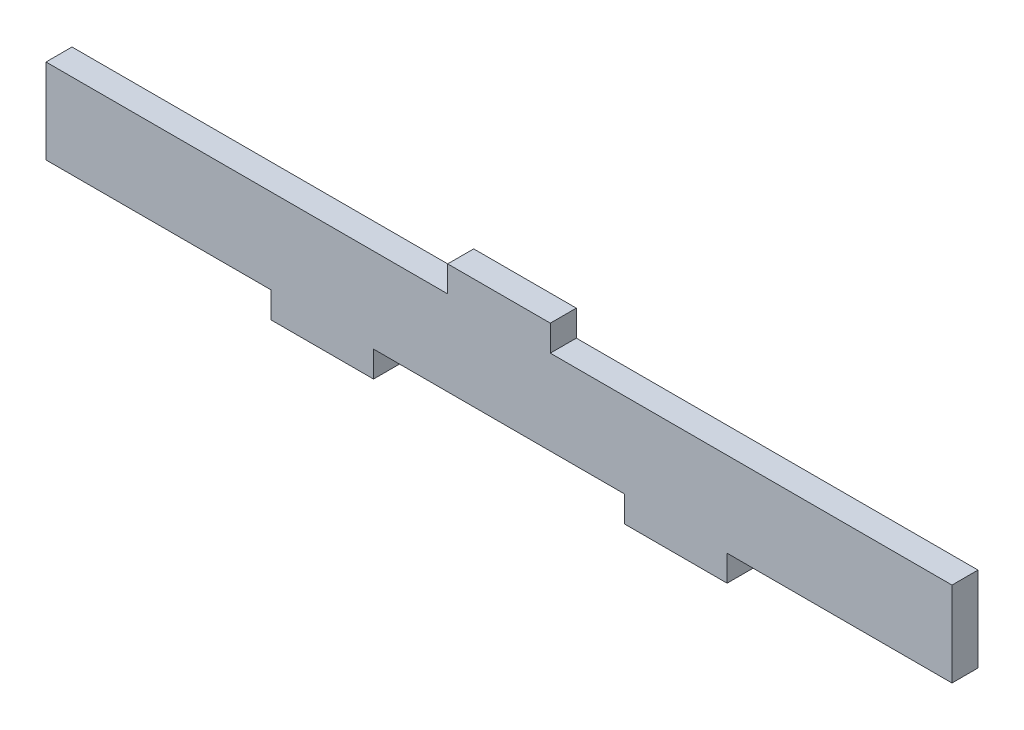
ISO-10303-21;
HEADER;
FILE_DESCRIPTION(('STEP AP214'),'2;1');
FILE_NAME('part.step','',(''),(''),'','','');
FILE_SCHEMA(('AUTOMOTIVE_DESIGN { 1 0 10303 214 1 1 1 1 }'));
ENDSEC;
DATA;
#1=APPLICATION_CONTEXT('core data for automotive mechanical design processes');
#2=APPLICATION_PROTOCOL_DEFINITION('international standard','automotive_design',2000,#1);
#3=PRODUCT_CONTEXT('',#1,'mechanical');
#4=PRODUCT('Part','Part','',(#3));
#5=PRODUCT_RELATED_PRODUCT_CATEGORY('part','',(#4));
#6=PRODUCT_DEFINITION_FORMATION('','',#4);
#7=PRODUCT_DEFINITION_CONTEXT('part definition',#1,'design');
#8=PRODUCT_DEFINITION('design','',#6,#7);
#9=PRODUCT_DEFINITION_SHAPE('','',#8);
#10=(LENGTH_UNIT() NAMED_UNIT(*) SI_UNIT(.MILLI.,.METRE.));
#11=(NAMED_UNIT(*) PLANE_ANGLE_UNIT() SI_UNIT($,.RADIAN.));
#12=(NAMED_UNIT(*) SI_UNIT($,.STERADIAN.) SOLID_ANGLE_UNIT());
#13=UNCERTAINTY_MEASURE_WITH_UNIT(LENGTH_MEASURE(1.E-05),#10,'distance_accuracy_value','');
#14=(GEOMETRIC_REPRESENTATION_CONTEXT(3) GLOBAL_UNCERTAINTY_ASSIGNED_CONTEXT((#13)) GLOBAL_UNIT_ASSIGNED_CONTEXT((#10,
#11,#12)) REPRESENTATION_CONTEXT('',''));
#15=CARTESIAN_POINT('',(0.,0.,0.));
#16=DIRECTION('',(0.,0.,1.));
#17=DIRECTION('',(1.,0.,0.));
#18=AXIS2_PLACEMENT_3D('',#15,#16,#17);
#19=CARTESIAN_POINT('',(0.,0.,4.826));
#20=DIRECTION('',(0.,1.,0.));
#21=DIRECTION('',(0.,0.,1.));
#22=AXIS2_PLACEMENT_3D('',#19,#20,#21);
#23=PLANE('',#22);
#24=DIRECTION('',(1.,0.,0.));
#25=VECTOR('',#24,1.);
#26=CARTESIAN_POINT('',(0.,0.,0.));
#27=LINE('',#26,#25);
#28=CARTESIAN_POINT('',(46.5666666666667,0.,0.));
#29=VERTEX_POINT('',#28);
#30=CARTESIAN_POINT('',(65.6166666666667,0.,0.));
#31=VERTEX_POINT('',#30);
#32=EDGE_CURVE('E227',#29,#31,#27,.T.);
#33=ORIENTED_EDGE('',*,*,#32,.T.);
#34=DIRECTION('',(0.,0.,1.));
#35=VECTOR('',#34,1.);
#36=CARTESIAN_POINT('',(65.6166666666667,0.,0.));
#37=LINE('',#36,#35);
#38=CARTESIAN_POINT('',(65.6166666666667,0.,4.826));
#39=VERTEX_POINT('',#38);
#40=EDGE_CURVE('E193',#31,#39,#37,.T.);
#41=ORIENTED_EDGE('',*,*,#40,.T.);
#42=DIRECTION('',(1.,0.,0.));
#43=VECTOR('',#42,1.);
#44=CARTESIAN_POINT('',(0.,0.,4.826));
#45=LINE('',#44,#43);
#46=CARTESIAN_POINT('',(46.5666666666667,0.,4.826));
#47=VERTEX_POINT('',#46);
#48=EDGE_CURVE('E41',#47,#39,#45,.T.);
#49=ORIENTED_EDGE('',*,*,#48,.F.);
#50=DIRECTION('',(0.,0.,1.));
#51=VECTOR('',#50,1.);
#52=CARTESIAN_POINT('',(46.5666666666667,0.,0.));
#53=LINE('',#52,#51);
#54=EDGE_CURVE('E216',#29,#47,#53,.T.);
#55=ORIENTED_EDGE('',*,*,#54,.F.);
#56=EDGE_LOOP('',(#33,#41,#49,#55));
#57=FACE_BOUND('',#56,.T.);
#58=ADVANCED_FACE('F32',(#57),#23,.F.);
#59=CARTESIAN_POINT('',(112.183333333333,0.,0.));
#60=VERTEX_POINT('',#59);
#61=CARTESIAN_POINT('',(131.233333333333,0.,0.));
#62=VERTEX_POINT('',#61);
#63=EDGE_CURVE('E223',#60,#62,#27,.T.);
#64=ORIENTED_EDGE('',*,*,#63,.T.);
#65=DIRECTION('',(0.,0.,1.));
#66=VECTOR('',#65,1.);
#67=CARTESIAN_POINT('',(131.233333333333,0.,0.));
#68=LINE('',#67,#66);
#69=CARTESIAN_POINT('',(131.233333333333,0.,4.826));
#70=VERTEX_POINT('',#69);
#71=EDGE_CURVE('E178',#62,#70,#68,.T.);
#72=ORIENTED_EDGE('',*,*,#71,.T.);
#73=CARTESIAN_POINT('',(112.183333333333,0.,4.826));
#74=VERTEX_POINT('',#73);
#75=EDGE_CURVE('E226',#74,#70,#45,.T.);
#76=ORIENTED_EDGE('',*,*,#75,.F.);
#77=DIRECTION('',(0.,0.,1.));
#78=VECTOR('',#77,1.);
#79=CARTESIAN_POINT('',(112.183333333333,0.,0.));
#80=LINE('',#79,#78);
#81=EDGE_CURVE('E205',#60,#74,#80,.T.);
#82=ORIENTED_EDGE('',*,*,#81,.F.);
#83=EDGE_LOOP('',(#64,#72,#76,#82));
#84=FACE_BOUND('',#83,.T.);
#85=ADVANCED_FACE('F34',(#84),#23,.F.);
#86=CARTESIAN_POINT('',(0.,25.4,4.826));
#87=DIRECTION('',(0.,-1.,0.));
#88=DIRECTION('',(0.,0.,-1.));
#89=AXIS2_PLACEMENT_3D('',#86,#87,#88);
#90=PLANE('',#89);
#91=DIRECTION('',(-1.,0.,0.));
#92=VECTOR('',#91,1.);
#93=CARTESIAN_POINT('',(0.,25.4,4.826));
#94=LINE('',#93,#92);
#95=CARTESIAN_POINT('',(98.425,25.4,4.826));
#96=VERTEX_POINT('',#95);
#97=CARTESIAN_POINT('',(79.375,25.4,4.826));
#98=VERTEX_POINT('',#97);
#99=EDGE_CURVE('E11',#96,#98,#94,.T.);
#100=ORIENTED_EDGE('',*,*,#99,.F.);
#101=DIRECTION('',(0.,0.,1.));
#102=VECTOR('',#101,1.);
#103=CARTESIAN_POINT('',(98.425,25.4,0.));
#104=LINE('',#103,#102);
#105=CARTESIAN_POINT('',(98.425,25.4,0.));
#106=VERTEX_POINT('',#105);
#107=EDGE_CURVE('E278',#106,#96,#104,.T.);
#108=ORIENTED_EDGE('',*,*,#107,.F.);
#109=DIRECTION('',(-1.,0.,0.));
#110=VECTOR('',#109,1.);
#111=CARTESIAN_POINT('',(0.,25.4,0.));
#112=LINE('',#111,#110);
#113=CARTESIAN_POINT('',(79.375,25.4,0.));
#114=VERTEX_POINT('',#113);
#115=EDGE_CURVE('E36',#106,#114,#112,.T.);
#116=ORIENTED_EDGE('',*,*,#115,.T.);
#117=DIRECTION('',(0.,0.,1.));
#118=VECTOR('',#117,1.);
#119=CARTESIAN_POINT('',(79.375,25.4,0.));
#120=LINE('',#119,#118);
#121=EDGE_CURVE('E176',#114,#98,#120,.T.);
#122=ORIENTED_EDGE('',*,*,#121,.T.);
#123=EDGE_LOOP('',(#100,#108,#116,#122));
#124=FACE_BOUND('',#123,.T.);
#125=ADVANCED_FACE('F310',(#124),#90,.F.);
#126=CARTESIAN_POINT('',(0.,0.,4.826));
#127=DIRECTION('',(0.,0.,-1.));
#128=DIRECTION('',(-1.,0.,0.));
#129=AXIS2_PLACEMENT_3D('',#126,#127,#128);
#130=PLANE('',#129);
#131=DIRECTION('',(-1.,0.,0.));
#132=VECTOR('',#131,1.);
#133=CARTESIAN_POINT('',(177.8,4.826,4.826));
#134=LINE('',#133,#132);
#135=CARTESIAN_POINT('',(172.974,4.826,4.826));
#136=VERTEX_POINT('',#135);
#137=CARTESIAN_POINT('',(131.233333333333,4.826,4.826));
#138=VERTEX_POINT('',#137);
#139=EDGE_CURVE('E170',#136,#138,#134,.T.);
#140=ORIENTED_EDGE('',*,*,#139,.F.);
#141=DIRECTION('',(0.,-1.,0.));
#142=VECTOR('',#141,1.);
#143=CARTESIAN_POINT('',(172.974,20.574,4.826));
#144=LINE('',#143,#142);
#145=CARTESIAN_POINT('',(172.974,20.574,4.826));
#146=VERTEX_POINT('',#145);
#147=EDGE_CURVE('E147',#146,#136,#144,.T.);
#148=ORIENTED_EDGE('',*,*,#147,.F.);
#149=DIRECTION('',(1.,0.,0.));
#150=VECTOR('',#149,1.);
#151=CARTESIAN_POINT('',(177.8,20.574,4.826));
#152=LINE('',#151,#150);
#153=CARTESIAN_POINT('',(98.425,20.574,4.826));
#154=VERTEX_POINT('',#153);
#155=EDGE_CURVE('E276',#154,#146,#152,.T.);
#156=ORIENTED_EDGE('',*,*,#155,.F.);
#157=DIRECTION('',(0.,-1.,0.));
#158=VECTOR('',#157,1.);
#159=CARTESIAN_POINT('',(98.425,25.4,4.826));
#160=LINE('',#159,#158);
#161=EDGE_CURVE('E269',#96,#154,#160,.T.);
#162=ORIENTED_EDGE('',*,*,#161,.F.);
#163=ORIENTED_EDGE('',*,*,#99,.T.);
#164=DIRECTION('',(0.,1.,0.));
#165=VECTOR('',#164,1.);
#166=CARTESIAN_POINT('',(79.375,25.4,4.826));
#167=LINE('',#166,#165);
#168=CARTESIAN_POINT('',(79.375,20.574,4.826));
#169=VERTEX_POINT('',#168);
#170=EDGE_CURVE('E290',#169,#98,#167,.T.);
#171=ORIENTED_EDGE('',*,*,#170,.F.);
#172=DIRECTION('',(1.,0.,0.));
#173=VECTOR('',#172,1.);
#174=CARTESIAN_POINT('',(0.,20.574,4.826));
#175=LINE('',#174,#173);
#176=CARTESIAN_POINT('',(4.826,20.574,4.826));
#177=VERTEX_POINT('',#176);
#178=EDGE_CURVE('E285',#177,#169,#175,.T.);
#179=ORIENTED_EDGE('',*,*,#178,.F.);
#180=DIRECTION('',(0.,1.,0.));
#181=VECTOR('',#180,1.);
#182=CARTESIAN_POINT('',(4.826,20.574,4.826));
#183=LINE('',#182,#181);
#184=CARTESIAN_POINT('',(4.826,4.826,4.826));
#185=VERTEX_POINT('',#184);
#186=EDGE_CURVE('E57',#185,#177,#183,.T.);
#187=ORIENTED_EDGE('',*,*,#186,.F.);
#188=DIRECTION('',(-1.,0.,0.));
#189=VECTOR('',#188,1.);
#190=CARTESIAN_POINT('',(0.,4.826,4.826));
#191=LINE('',#190,#189);
#192=CARTESIAN_POINT('',(46.5666666666667,4.826,4.826));
#193=VERTEX_POINT('',#192);
#194=EDGE_CURVE('E213',#193,#185,#191,.T.);
#195=ORIENTED_EDGE('',*,*,#194,.F.);
#196=DIRECTION('',(0.,1.,0.));
#197=VECTOR('',#196,1.);
#198=CARTESIAN_POINT('',(46.5666666666667,0.,4.826));
#199=LINE('',#198,#197);
#200=EDGE_CURVE('E202',#47,#193,#199,.T.);
#201=ORIENTED_EDGE('',*,*,#200,.F.);
#202=ORIENTED_EDGE('',*,*,#48,.T.);
#203=DIRECTION('',(0.,-1.,0.));
#204=VECTOR('',#203,1.);
#205=CARTESIAN_POINT('',(65.6166666666667,0.,4.826));
#206=LINE('',#205,#204);
#207=CARTESIAN_POINT('',(65.6166666666667,4.826,4.826));
#208=VERTEX_POINT('',#207);
#209=EDGE_CURVE('E181',#208,#39,#206,.T.);
#210=ORIENTED_EDGE('',*,*,#209,.F.);
#211=DIRECTION('',(-1.,0.,0.));
#212=VECTOR('',#211,1.);
#213=CARTESIAN_POINT('',(65.6166666666667,4.826,4.826));
#214=LINE('',#213,#212);
#215=CARTESIAN_POINT('',(112.183333333333,4.826,4.826));
#216=VERTEX_POINT('',#215);
#217=EDGE_CURVE('E187',#216,#208,#214,.T.);
#218=ORIENTED_EDGE('',*,*,#217,.F.);
#219=DIRECTION('',(0.,1.,0.));
#220=VECTOR('',#219,1.);
#221=CARTESIAN_POINT('',(112.183333333333,0.,4.826));
#222=LINE('',#221,#220);
#223=EDGE_CURVE('E195',#74,#216,#222,.T.);
#224=ORIENTED_EDGE('',*,*,#223,.F.);
#225=ORIENTED_EDGE('',*,*,#75,.T.);
#226=DIRECTION('',(0.,-1.,0.));
#227=VECTOR('',#226,1.);
#228=CARTESIAN_POINT('',(131.233333333333,0.,4.826));
#229=LINE('',#228,#227);
#230=EDGE_CURVE('E167',#138,#70,#229,.T.);
#231=ORIENTED_EDGE('',*,*,#230,.F.);
#232=EDGE_LOOP('',(#140,#148,#156,#162,#163,#171,#179,#187,#195,#201,#202,#210,#218,#224,#225,#231));
#233=FACE_BOUND('',#232,.T.);
#234=ADVANCED_FACE('F242',(#233),#130,.F.);
#235=CARTESIAN_POINT('',(0.,0.,0.));
#236=DIRECTION('',(0.,0.,-1.));
#237=DIRECTION('',(-1.,0.,0.));
#238=AXIS2_PLACEMENT_3D('',#235,#236,#237);
#239=PLANE('',#238);
#240=DIRECTION('',(0.,-1.,0.));
#241=VECTOR('',#240,1.);
#242=CARTESIAN_POINT('',(172.974,20.574,0.));
#243=LINE('',#242,#241);
#244=CARTESIAN_POINT('',(172.974,20.574,0.));
#245=VERTEX_POINT('',#244);
#246=CARTESIAN_POINT('',(172.974,4.826,0.));
#247=VERTEX_POINT('',#246);
#248=EDGE_CURVE('E49',#245,#247,#243,.T.);
#249=ORIENTED_EDGE('',*,*,#248,.T.);
#250=DIRECTION('',(-1.,0.,0.));
#251=VECTOR('',#250,1.);
#252=CARTESIAN_POINT('',(177.8,4.826,0.));
#253=LINE('',#252,#251);
#254=CARTESIAN_POINT('',(131.233333333333,4.826,0.));
#255=VERTEX_POINT('',#254);
#256=EDGE_CURVE('E157',#247,#255,#253,.T.);
#257=ORIENTED_EDGE('',*,*,#256,.T.);
#258=DIRECTION('',(0.,-1.,0.));
#259=VECTOR('',#258,1.);
#260=CARTESIAN_POINT('',(131.233333333333,0.,0.));
#261=LINE('',#260,#259);
#262=EDGE_CURVE('E166',#255,#62,#261,.T.);
#263=ORIENTED_EDGE('',*,*,#262,.T.);
#264=ORIENTED_EDGE('',*,*,#63,.F.);
#265=DIRECTION('',(0.,1.,0.));
#266=VECTOR('',#265,1.);
#267=CARTESIAN_POINT('',(112.183333333333,0.,0.));
#268=LINE('',#267,#266);
#269=CARTESIAN_POINT('',(112.183333333333,4.826,0.));
#270=VERTEX_POINT('',#269);
#271=EDGE_CURVE('E186',#60,#270,#268,.T.);
#272=ORIENTED_EDGE('',*,*,#271,.T.);
#273=DIRECTION('',(-1.,0.,0.));
#274=VECTOR('',#273,1.);
#275=CARTESIAN_POINT('',(65.6166666666667,4.826,0.));
#276=LINE('',#275,#274);
#277=CARTESIAN_POINT('',(65.6166666666667,4.826,0.));
#278=VERTEX_POINT('',#277);
#279=EDGE_CURVE('E190',#270,#278,#276,.T.);
#280=ORIENTED_EDGE('',*,*,#279,.T.);
#281=DIRECTION('',(0.,-1.,0.));
#282=VECTOR('',#281,1.);
#283=CARTESIAN_POINT('',(65.6166666666667,0.,0.));
#284=LINE('',#283,#282);
#285=EDGE_CURVE('E183',#278,#31,#284,.T.);
#286=ORIENTED_EDGE('',*,*,#285,.T.);
#287=ORIENTED_EDGE('',*,*,#32,.F.);
#288=DIRECTION('',(0.,1.,0.));
#289=VECTOR('',#288,1.);
#290=CARTESIAN_POINT('',(46.5666666666667,0.,0.));
#291=LINE('',#290,#289);
#292=CARTESIAN_POINT('',(46.5666666666667,4.826,0.));
#293=VERTEX_POINT('',#292);
#294=EDGE_CURVE('E209',#29,#293,#291,.T.);
#295=ORIENTED_EDGE('',*,*,#294,.T.);
#296=DIRECTION('',(-1.,0.,0.));
#297=VECTOR('',#296,1.);
#298=CARTESIAN_POINT('',(0.,4.826,0.));
#299=LINE('',#298,#297);
#300=CARTESIAN_POINT('',(4.826,4.826,0.));
#301=VERTEX_POINT('',#300);
#302=EDGE_CURVE('E212',#293,#301,#299,.T.);
#303=ORIENTED_EDGE('',*,*,#302,.T.);
#304=DIRECTION('',(0.,1.,0.));
#305=VECTOR('',#304,1.);
#306=CARTESIAN_POINT('',(4.826,20.574,0.));
#307=LINE('',#306,#305);
#308=CARTESIAN_POINT('',(4.826,20.574,0.));
#309=VERTEX_POINT('',#308);
#310=EDGE_CURVE('E261',#301,#309,#307,.T.);
#311=ORIENTED_EDGE('',*,*,#310,.T.);
#312=DIRECTION('',(1.,0.,0.));
#313=VECTOR('',#312,1.);
#314=CARTESIAN_POINT('',(0.,20.574,0.));
#315=LINE('',#314,#313);
#316=CARTESIAN_POINT('',(79.375,20.574,0.));
#317=VERTEX_POINT('',#316);
#318=EDGE_CURVE('E287',#309,#317,#315,.T.);
#319=ORIENTED_EDGE('',*,*,#318,.T.);
#320=DIRECTION('',(0.,1.,0.));
#321=VECTOR('',#320,1.);
#322=CARTESIAN_POINT('',(79.375,25.4,0.));
#323=LINE('',#322,#321);
#324=EDGE_CURVE('E289',#317,#114,#323,.T.);
#325=ORIENTED_EDGE('',*,*,#324,.T.);
#326=ORIENTED_EDGE('',*,*,#115,.F.);
#327=DIRECTION('',(0.,-1.,0.));
#328=VECTOR('',#327,1.);
#329=CARTESIAN_POINT('',(98.425,25.4,0.));
#330=LINE('',#329,#328);
#331=CARTESIAN_POINT('',(98.425,20.574,0.));
#332=VERTEX_POINT('',#331);
#333=EDGE_CURVE('E274',#106,#332,#330,.T.);
#334=ORIENTED_EDGE('',*,*,#333,.T.);
#335=DIRECTION('',(1.,0.,0.));
#336=VECTOR('',#335,1.);
#337=CARTESIAN_POINT('',(177.8,20.574,0.));
#338=LINE('',#337,#336);
#339=EDGE_CURVE('E160',#332,#245,#338,.T.);
#340=ORIENTED_EDGE('',*,*,#339,.T.);
#341=EDGE_LOOP('',(#249,#257,#263,#264,#272,#280,#286,#287,#295,#303,#311,#319,#325,#326,#334,#340));
#342=FACE_BOUND('',#341,.T.);
#343=ADVANCED_FACE('F155',(#342),#239,.T.);
#344=CARTESIAN_POINT('',(0.,4.826,0.));
#345=DIRECTION('',(0.,1.,0.));
#346=DIRECTION('',(0.,0.,1.));
#347=AXIS2_PLACEMENT_3D('',#344,#345,#346);
#348=PLANE('',#347);
#349=ORIENTED_EDGE('',*,*,#194,.T.);
#350=DIRECTION('',(0.,0.,1.));
#351=VECTOR('',#350,1.);
#352=CARTESIAN_POINT('',(4.826,4.826,0.));
#353=LINE('',#352,#351);
#354=EDGE_CURVE('E266',#301,#185,#353,.T.);
#355=ORIENTED_EDGE('',*,*,#354,.F.);
#356=ORIENTED_EDGE('',*,*,#302,.F.);
#357=DIRECTION('',(0.,0.,1.));
#358=VECTOR('',#357,1.);
#359=CARTESIAN_POINT('',(46.5666666666667,4.826,0.));
#360=LINE('',#359,#358);
#361=EDGE_CURVE('E221',#293,#193,#360,.T.);
#362=ORIENTED_EDGE('',*,*,#361,.T.);
#363=EDGE_LOOP('',(#349,#355,#356,#362));
#364=FACE_BOUND('',#363,.T.);
#365=ADVANCED_FACE('F265',(#364),#348,.F.);
#366=CARTESIAN_POINT('',(46.5666666666667,0.,0.));
#367=DIRECTION('',(1.,0.,0.));
#368=DIRECTION('',(0.,0.,-1.));
#369=AXIS2_PLACEMENT_3D('',#366,#367,#368);
#370=PLANE('',#369);
#371=ORIENTED_EDGE('',*,*,#200,.T.);
#372=ORIENTED_EDGE('',*,*,#361,.F.);
#373=ORIENTED_EDGE('',*,*,#294,.F.);
#374=ORIENTED_EDGE('',*,*,#54,.T.);
#375=EDGE_LOOP('',(#371,#372,#373,#374));
#376=FACE_BOUND('',#375,.T.);
#377=ADVANCED_FACE('F259',(#376),#370,.F.);
#378=CARTESIAN_POINT('',(65.6166666666667,0.,0.));
#379=DIRECTION('',(-1.,0.,0.));
#380=DIRECTION('',(0.,0.,1.));
#381=AXIS2_PLACEMENT_3D('',#378,#379,#380);
#382=PLANE('',#381);
#383=ORIENTED_EDGE('',*,*,#209,.T.);
#384=ORIENTED_EDGE('',*,*,#40,.F.);
#385=ORIENTED_EDGE('',*,*,#285,.F.);
#386=DIRECTION('',(0.,0.,1.));
#387=VECTOR('',#386,1.);
#388=CARTESIAN_POINT('',(65.6166666666667,4.826,0.));
#389=LINE('',#388,#387);
#390=EDGE_CURVE('E200',#278,#208,#389,.T.);
#391=ORIENTED_EDGE('',*,*,#390,.T.);
#392=EDGE_LOOP('',(#383,#384,#385,#391));
#393=FACE_BOUND('',#392,.T.);
#394=ADVANCED_FACE('F253',(#393),#382,.F.);
#395=CARTESIAN_POINT('',(65.6166666666667,4.826,0.));
#396=DIRECTION('',(0.,1.,0.));
#397=DIRECTION('',(0.,0.,1.));
#398=AXIS2_PLACEMENT_3D('',#395,#396,#397);
#399=PLANE('',#398);
#400=ORIENTED_EDGE('',*,*,#217,.T.);
#401=ORIENTED_EDGE('',*,*,#390,.F.);
#402=ORIENTED_EDGE('',*,*,#279,.F.);
#403=DIRECTION('',(0.,0.,1.));
#404=VECTOR('',#403,1.);
#405=CARTESIAN_POINT('',(112.183333333333,4.826,0.));
#406=LINE('',#405,#404);
#407=EDGE_CURVE('E203',#270,#216,#406,.T.);
#408=ORIENTED_EDGE('',*,*,#407,.T.);
#409=EDGE_LOOP('',(#400,#401,#402,#408));
#410=FACE_BOUND('',#409,.T.);
#411=ADVANCED_FACE('F250',(#410),#399,.F.);
#412=CARTESIAN_POINT('',(112.183333333333,0.,0.));
#413=DIRECTION('',(1.,0.,0.));
#414=DIRECTION('',(0.,0.,-1.));
#415=AXIS2_PLACEMENT_3D('',#412,#413,#414);
#416=PLANE('',#415);
#417=ORIENTED_EDGE('',*,*,#223,.T.);
#418=ORIENTED_EDGE('',*,*,#407,.F.);
#419=ORIENTED_EDGE('',*,*,#271,.F.);
#420=ORIENTED_EDGE('',*,*,#81,.T.);
#421=EDGE_LOOP('',(#417,#418,#419,#420));
#422=FACE_BOUND('',#421,.T.);
#423=ADVANCED_FACE('F248',(#422),#416,.F.);
#424=CARTESIAN_POINT('',(131.233333333333,0.,0.));
#425=DIRECTION('',(-1.,0.,0.));
#426=DIRECTION('',(0.,0.,1.));
#427=AXIS2_PLACEMENT_3D('',#424,#425,#426);
#428=PLANE('',#427);
#429=ORIENTED_EDGE('',*,*,#230,.T.);
#430=ORIENTED_EDGE('',*,*,#71,.F.);
#431=ORIENTED_EDGE('',*,*,#262,.F.);
#432=DIRECTION('',(0.,0.,1.));
#433=VECTOR('',#432,1.);
#434=CARTESIAN_POINT('',(131.233333333333,4.826,0.));
#435=LINE('',#434,#433);
#436=EDGE_CURVE('E165',#255,#138,#435,.T.);
#437=ORIENTED_EDGE('',*,*,#436,.T.);
#438=EDGE_LOOP('',(#429,#430,#431,#437));
#439=FACE_BOUND('',#438,.T.);
#440=ADVANCED_FACE('F239',(#439),#428,.F.);
#441=CARTESIAN_POINT('',(177.8,4.826,0.));
#442=DIRECTION('',(0.,1.,0.));
#443=DIRECTION('',(0.,0.,1.));
#444=AXIS2_PLACEMENT_3D('',#441,#442,#443);
#445=PLANE('',#444);
#446=ORIENTED_EDGE('',*,*,#256,.F.);
#447=DIRECTION('',(0.,0.,1.));
#448=VECTOR('',#447,1.);
#449=CARTESIAN_POINT('',(172.974,4.826,0.));
#450=LINE('',#449,#448);
#451=EDGE_CURVE('E144',#247,#136,#450,.T.);
#452=ORIENTED_EDGE('',*,*,#451,.T.);
#453=ORIENTED_EDGE('',*,*,#139,.T.);
#454=ORIENTED_EDGE('',*,*,#436,.F.);
#455=EDGE_LOOP('',(#446,#452,#453,#454));
#456=FACE_BOUND('',#455,.T.);
#457=ADVANCED_FACE('F163',(#456),#445,.F.);
#458=CARTESIAN_POINT('',(79.375,25.4,0.));
#459=DIRECTION('',(1.,0.,0.));
#460=DIRECTION('',(0.,1.,0.));
#461=AXIS2_PLACEMENT_3D('',#458,#459,#460);
#462=PLANE('',#461);
#463=ORIENTED_EDGE('',*,*,#170,.T.);
#464=ORIENTED_EDGE('',*,*,#121,.F.);
#465=ORIENTED_EDGE('',*,*,#324,.F.);
#466=DIRECTION('',(0.,0.,1.));
#467=VECTOR('',#466,1.);
#468=CARTESIAN_POINT('',(79.375,20.574,0.));
#469=LINE('',#468,#467);
#470=EDGE_CURVE('E173',#317,#169,#469,.T.);
#471=ORIENTED_EDGE('',*,*,#470,.T.);
#472=EDGE_LOOP('',(#463,#464,#465,#471));
#473=FACE_BOUND('',#472,.T.);
#474=ADVANCED_FACE('F304',(#473),#462,.F.);
#475=CARTESIAN_POINT('',(0.,20.574,0.));
#476=DIRECTION('',(0.,-1.,0.));
#477=DIRECTION('',(0.,0.,-1.));
#478=AXIS2_PLACEMENT_3D('',#475,#476,#477);
#479=PLANE('',#478);
#480=ORIENTED_EDGE('',*,*,#318,.F.);
#481=DIRECTION('',(0.,0.,1.));
#482=VECTOR('',#481,1.);
#483=CARTESIAN_POINT('',(4.826,20.574,0.));
#484=LINE('',#483,#482);
#485=EDGE_CURVE('E267',#309,#177,#484,.T.);
#486=ORIENTED_EDGE('',*,*,#485,.T.);
#487=ORIENTED_EDGE('',*,*,#178,.T.);
#488=ORIENTED_EDGE('',*,*,#470,.F.);
#489=EDGE_LOOP('',(#480,#486,#487,#488));
#490=FACE_BOUND('',#489,.T.);
#491=ADVANCED_FACE('F313',(#490),#479,.F.);
#492=CARTESIAN_POINT('',(177.8,20.574,0.));
#493=DIRECTION('',(0.,-1.,0.));
#494=DIRECTION('',(0.,0.,-1.));
#495=AXIS2_PLACEMENT_3D('',#492,#493,#494);
#496=PLANE('',#495);
#497=ORIENTED_EDGE('',*,*,#155,.T.);
#498=DIRECTION('',(0.,0.,1.));
#499=VECTOR('',#498,1.);
#500=CARTESIAN_POINT('',(172.974,20.574,0.));
#501=LINE('',#500,#499);
#502=EDGE_CURVE('E151',#245,#146,#501,.T.);
#503=ORIENTED_EDGE('',*,*,#502,.F.);
#504=ORIENTED_EDGE('',*,*,#339,.F.);
#505=DIRECTION('',(0.,0.,1.));
#506=VECTOR('',#505,1.);
#507=CARTESIAN_POINT('',(98.425,20.574,0.));
#508=LINE('',#507,#506);
#509=EDGE_CURVE('E283',#332,#154,#508,.T.);
#510=ORIENTED_EDGE('',*,*,#509,.T.);
#511=EDGE_LOOP('',(#497,#503,#504,#510));
#512=FACE_BOUND('',#511,.T.);
#513=ADVANCED_FACE('F323',(#512),#496,.F.);
#514=CARTESIAN_POINT('',(98.425,25.4,0.));
#515=DIRECTION('',(-1.,0.,0.));
#516=DIRECTION('',(0.,0.,1.));
#517=AXIS2_PLACEMENT_3D('',#514,#515,#516);
#518=PLANE('',#517);
#519=ORIENTED_EDGE('',*,*,#161,.T.);
#520=ORIENTED_EDGE('',*,*,#509,.F.);
#521=ORIENTED_EDGE('',*,*,#333,.F.);
#522=ORIENTED_EDGE('',*,*,#107,.T.);
#523=EDGE_LOOP('',(#519,#520,#521,#522));
#524=FACE_BOUND('',#523,.T.);
#525=ADVANCED_FACE('F316',(#524),#518,.F.);
#526=CARTESIAN_POINT('',(4.826,20.574,0.));
#527=DIRECTION('',(1.,0.,0.));
#528=DIRECTION('',(0.,1.,0.));
#529=AXIS2_PLACEMENT_3D('',#526,#527,#528);
#530=PLANE('',#529);
#531=ORIENTED_EDGE('',*,*,#186,.T.);
#532=ORIENTED_EDGE('',*,*,#485,.F.);
#533=ORIENTED_EDGE('',*,*,#310,.F.);
#534=ORIENTED_EDGE('',*,*,#354,.T.);
#535=EDGE_LOOP('',(#531,#532,#533,#534));
#536=FACE_BOUND('',#535,.T.);
#537=ADVANCED_FACE('F314',(#536),#530,.F.);
#538=CARTESIAN_POINT('',(172.974,20.574,0.));
#539=DIRECTION('',(-1.,0.,0.));
#540=DIRECTION('',(0.,0.,1.));
#541=AXIS2_PLACEMENT_3D('',#538,#539,#540);
#542=PLANE('',#541);
#543=ORIENTED_EDGE('',*,*,#147,.T.);
#544=ORIENTED_EDGE('',*,*,#451,.F.);
#545=ORIENTED_EDGE('',*,*,#248,.F.);
#546=ORIENTED_EDGE('',*,*,#502,.T.);
#547=EDGE_LOOP('',(#543,#544,#545,#546));
#548=FACE_BOUND('',#547,.T.);
#549=ADVANCED_FACE('F145',(#548),#542,.F.);
#550=CLOSED_SHELL('',(#58,#85,#125,#234,#343,#365,#377,#394,#411,#423,#440,#457,#474,#491,#513,
#525,#537,#549));
#551=MANIFOLD_SOLID_BREP('B2',#550);
#552=ADVANCED_BREP_SHAPE_REPRESENTATION('',(#18,#551),#14);
#553=SHAPE_DEFINITION_REPRESENTATION(#9,#552);
ENDSEC;
END-ISO-10303-21;
